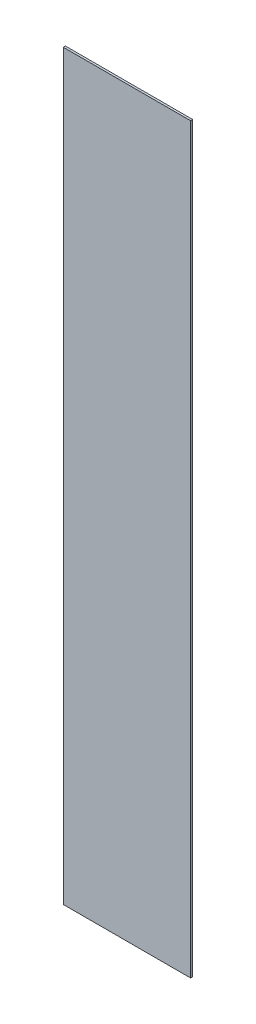
ISO-10303-21;
HEADER;
FILE_DESCRIPTION(('STEP AP214'),'2;1');
FILE_NAME('part.step','',(''),(''),'','','');
FILE_SCHEMA(('AUTOMOTIVE_DESIGN { 1 0 10303 214 1 1 1 1 }'));
ENDSEC;
DATA;
#1=APPLICATION_CONTEXT('core data for automotive mechanical design processes');
#2=APPLICATION_PROTOCOL_DEFINITION('international standard','automotive_design',2000,#1);
#3=PRODUCT_CONTEXT('',#1,'mechanical');
#4=PRODUCT('Part','Part','',(#3));
#5=PRODUCT_RELATED_PRODUCT_CATEGORY('part','',(#4));
#6=PRODUCT_DEFINITION_FORMATION('','',#4);
#7=PRODUCT_DEFINITION_CONTEXT('part definition',#1,'design');
#8=PRODUCT_DEFINITION('design','',#6,#7);
#9=PRODUCT_DEFINITION_SHAPE('','',#8);
#10=(LENGTH_UNIT() NAMED_UNIT(*) SI_UNIT(.MILLI.,.METRE.));
#11=(NAMED_UNIT(*) PLANE_ANGLE_UNIT() SI_UNIT($,.RADIAN.));
#12=(NAMED_UNIT(*) SI_UNIT($,.STERADIAN.) SOLID_ANGLE_UNIT());
#13=UNCERTAINTY_MEASURE_WITH_UNIT(LENGTH_MEASURE(1.E-05),#10,'distance_accuracy_value','');
#14=(GEOMETRIC_REPRESENTATION_CONTEXT(3) GLOBAL_UNCERTAINTY_ASSIGNED_CONTEXT((#13)) GLOBAL_UNIT_ASSIGNED_CONTEXT((#10,
#11,#12)) REPRESENTATION_CONTEXT('',''));
#15=CARTESIAN_POINT('',(0.,0.,0.));
#16=DIRECTION('',(0.,0.,1.));
#17=DIRECTION('',(1.,0.,0.));
#18=AXIS2_PLACEMENT_3D('',#15,#16,#17);
#19=CARTESIAN_POINT('',(0.,0.,0.002));
#20=DIRECTION('',(0.,0.,1.));
#21=DIRECTION('',(1.,0.,0.));
#22=AXIS2_PLACEMENT_3D('',#19,#20,#21);
#23=PLANE('',#22);
#24=DIRECTION('',(0.,1.,0.));
#25=VECTOR('',#24,1.);
#26=CARTESIAN_POINT('',(0.12,0.,0.002));
#27=LINE('',#26,#25);
#28=CARTESIAN_POINT('',(0.12,0.7,0.002));
#29=VERTEX_POINT('',#28);
#30=CARTESIAN_POINT('',(0.12,0.,0.002));
#31=VERTEX_POINT('',#30);
#32=EDGE_CURVE('E76',#29,#31,#27,.F.);
#33=ORIENTED_EDGE('',*,*,#32,.F.);
#34=DIRECTION('',(1.,0.,0.));
#35=VECTOR('',#34,1.);
#36=CARTESIAN_POINT('',(0.,0.7,0.002));
#37=LINE('',#36,#35);
#38=CARTESIAN_POINT('',(0.,0.7,0.002));
#39=VERTEX_POINT('',#38);
#40=EDGE_CURVE('E58',#39,#29,#37,.T.);
#41=ORIENTED_EDGE('',*,*,#40,.F.);
#42=DIRECTION('',(0.,1.,0.));
#43=VECTOR('',#42,1.);
#44=CARTESIAN_POINT('',(0.,0.,0.002));
#45=LINE('',#44,#43);
#46=CARTESIAN_POINT('',(0.,0.,0.002));
#47=VERTEX_POINT('',#46);
#48=EDGE_CURVE('E20',#39,#47,#45,.F.);
#49=ORIENTED_EDGE('',*,*,#48,.T.);
#50=DIRECTION('',(1.,0.,0.));
#51=VECTOR('',#50,1.);
#52=CARTESIAN_POINT('',(0.,0.,0.002));
#53=LINE('',#52,#51);
#54=EDGE_CURVE('E55',#47,#31,#53,.T.);
#55=ORIENTED_EDGE('',*,*,#54,.T.);
#56=EDGE_LOOP('',(#33,#41,#49,#55));
#57=FACE_BOUND('',#56,.T.);
#58=ADVANCED_FACE('F17',(#57),#23,.T.);
#59=CARTESIAN_POINT('',(0.,0.,0.));
#60=DIRECTION('',(1.,0.,0.));
#61=DIRECTION('',(0.,0.,-1.));
#62=AXIS2_PLACEMENT_3D('',#59,#60,#61);
#63=PLANE('',#62);
#64=DIRECTION('',(0.,0.,1.));
#65=VECTOR('',#64,1.);
#66=CARTESIAN_POINT('',(0.,0.7,0.));
#67=LINE('',#66,#65);
#68=CARTESIAN_POINT('',(0.,0.7,0.));
#69=VERTEX_POINT('',#68);
#70=EDGE_CURVE('E78',#69,#39,#67,.T.);
#71=ORIENTED_EDGE('',*,*,#70,.F.);
#72=DIRECTION('',(0.,1.,0.));
#73=VECTOR('',#72,1.);
#74=CARTESIAN_POINT('',(0.,0.,0.));
#75=LINE('',#74,#73);
#76=CARTESIAN_POINT('',(0.,0.,0.));
#77=VERTEX_POINT('',#76);
#78=EDGE_CURVE('E73',#69,#77,#75,.F.);
#79=ORIENTED_EDGE('',*,*,#78,.T.);
#80=DIRECTION('',(0.,0.,1.));
#81=VECTOR('',#80,1.);
#82=CARTESIAN_POINT('',(0.,0.,0.));
#83=LINE('',#82,#81);
#84=EDGE_CURVE('E63',#77,#47,#83,.T.);
#85=ORIENTED_EDGE('',*,*,#84,.T.);
#86=ORIENTED_EDGE('',*,*,#48,.F.);
#87=EDGE_LOOP('',(#71,#79,#85,#86));
#88=FACE_BOUND('',#87,.T.);
#89=ADVANCED_FACE('F72',(#88),#63,.F.);
#90=CARTESIAN_POINT('',(0.,0.,0.));
#91=DIRECTION('',(0.,1.,0.));
#92=DIRECTION('',(0.,0.,1.));
#93=AXIS2_PLACEMENT_3D('',#90,#91,#92);
#94=PLANE('',#93);
#95=ORIENTED_EDGE('',*,*,#54,.F.);
#96=ORIENTED_EDGE('',*,*,#84,.F.);
#97=DIRECTION('',(1.,0.,0.));
#98=VECTOR('',#97,1.);
#99=CARTESIAN_POINT('',(0.,0.,0.));
#100=LINE('',#99,#98);
#101=CARTESIAN_POINT('',(0.12,0.,0.));
#102=VERTEX_POINT('',#101);
#103=EDGE_CURVE('E83',#77,#102,#100,.T.);
#104=ORIENTED_EDGE('',*,*,#103,.T.);
#105=DIRECTION('',(0.,0.,-1.));
#106=VECTOR('',#105,1.);
#107=CARTESIAN_POINT('',(0.12,0.,0.));
#108=LINE('',#107,#106);
#109=EDGE_CURVE('E69',#31,#102,#108,.T.);
#110=ORIENTED_EDGE('',*,*,#109,.F.);
#111=EDGE_LOOP('',(#95,#96,#104,#110));
#112=FACE_BOUND('',#111,.T.);
#113=ADVANCED_FACE('F66',(#112),#94,.F.);
#114=CARTESIAN_POINT('',(0.12,0.,0.));
#115=DIRECTION('',(1.,0.,0.));
#116=DIRECTION('',(0.,0.,-1.));
#117=AXIS2_PLACEMENT_3D('',#114,#115,#116);
#118=PLANE('',#117);
#119=DIRECTION('',(0.,0.,1.));
#120=VECTOR('',#119,1.);
#121=CARTESIAN_POINT('',(0.12,0.7,0.));
#122=LINE('',#121,#120);
#123=CARTESIAN_POINT('',(0.12,0.7,0.));
#124=VERTEX_POINT('',#123);
#125=EDGE_CURVE('E34',#29,#124,#122,.F.);
#126=ORIENTED_EDGE('',*,*,#125,.F.);
#127=ORIENTED_EDGE('',*,*,#32,.T.);
#128=ORIENTED_EDGE('',*,*,#109,.T.);
#129=DIRECTION('',(0.,1.,0.));
#130=VECTOR('',#129,1.);
#131=CARTESIAN_POINT('',(0.12,0.,0.));
#132=LINE('',#131,#130);
#133=EDGE_CURVE('E26',#102,#124,#132,.T.);
#134=ORIENTED_EDGE('',*,*,#133,.T.);
#135=EDGE_LOOP('',(#126,#127,#128,#134));
#136=FACE_BOUND('',#135,.T.);
#137=ADVANCED_FACE('F88',(#136),#118,.T.);
#138=CARTESIAN_POINT('',(0.,0.7,0.));
#139=DIRECTION('',(0.,1.,0.));
#140=DIRECTION('',(0.,0.,1.));
#141=AXIS2_PLACEMENT_3D('',#138,#139,#140);
#142=PLANE('',#141);
#143=ORIENTED_EDGE('',*,*,#40,.T.);
#144=ORIENTED_EDGE('',*,*,#125,.T.);
#145=DIRECTION('',(1.,0.,0.));
#146=VECTOR('',#145,1.);
#147=CARTESIAN_POINT('',(0.,0.7,0.));
#148=LINE('',#147,#146);
#149=EDGE_CURVE('E11',#124,#69,#148,.F.);
#150=ORIENTED_EDGE('',*,*,#149,.T.);
#151=ORIENTED_EDGE('',*,*,#70,.T.);
#152=EDGE_LOOP('',(#143,#144,#150,#151));
#153=FACE_BOUND('',#152,.T.);
#154=ADVANCED_FACE('F91',(#153),#142,.T.);
#155=CARTESIAN_POINT('',(0.,0.,0.));
#156=DIRECTION('',(0.,0.,1.));
#157=DIRECTION('',(1.,0.,0.));
#158=AXIS2_PLACEMENT_3D('',#155,#156,#157);
#159=PLANE('',#158);
#160=ORIENTED_EDGE('',*,*,#133,.F.);
#161=ORIENTED_EDGE('',*,*,#103,.F.);
#162=ORIENTED_EDGE('',*,*,#78,.F.);
#163=ORIENTED_EDGE('',*,*,#149,.F.);
#164=EDGE_LOOP('',(#160,#161,#162,#163));
#165=FACE_BOUND('',#164,.T.);
#166=ADVANCED_FACE('F90',(#165),#159,.F.);
#167=CLOSED_SHELL('',(#58,#89,#113,#137,#154,#166));
#168=MANIFOLD_SOLID_BREP('B1',#167);
#169=ADVANCED_BREP_SHAPE_REPRESENTATION('',(#18,#168),#14);
#170=SHAPE_DEFINITION_REPRESENTATION(#9,#169);
ENDSEC;
END-ISO-10303-21;
